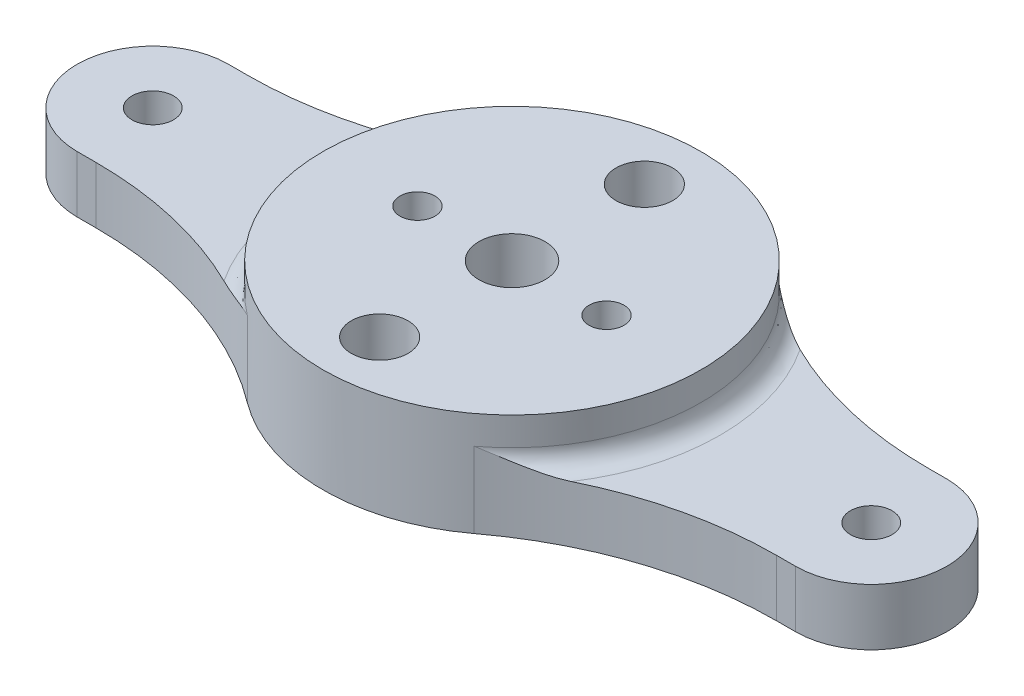
ISO-10303-21;
HEADER;
FILE_DESCRIPTION(('STEP AP214'),'2;1');
FILE_NAME('part.step','',(''),(''),'','','');
FILE_SCHEMA(('AUTOMOTIVE_DESIGN { 1 0 10303 214 1 1 1 1 }'));
ENDSEC;
DATA;
#1=APPLICATION_CONTEXT('core data for automotive mechanical design processes');
#2=APPLICATION_PROTOCOL_DEFINITION('international standard','automotive_design',2000,#1);
#3=PRODUCT_CONTEXT('',#1,'mechanical');
#4=PRODUCT('Part','Part','',(#3));
#5=PRODUCT_RELATED_PRODUCT_CATEGORY('part','',(#4));
#6=PRODUCT_DEFINITION_FORMATION('','',#4);
#7=PRODUCT_DEFINITION_CONTEXT('part definition',#1,'design');
#8=PRODUCT_DEFINITION('design','',#6,#7);
#9=PRODUCT_DEFINITION_SHAPE('','',#8);
#10=(LENGTH_UNIT() NAMED_UNIT(*) SI_UNIT(.MILLI.,.METRE.));
#11=(NAMED_UNIT(*) PLANE_ANGLE_UNIT() SI_UNIT($,.RADIAN.));
#12=(NAMED_UNIT(*) SI_UNIT($,.STERADIAN.) SOLID_ANGLE_UNIT());
#13=UNCERTAINTY_MEASURE_WITH_UNIT(LENGTH_MEASURE(1.E-05),#10,'distance_accuracy_value','');
#14=(GEOMETRIC_REPRESENTATION_CONTEXT(3) GLOBAL_UNCERTAINTY_ASSIGNED_CONTEXT((#13)) GLOBAL_UNIT_ASSIGNED_CONTEXT((#10,
#11,#12)) REPRESENTATION_CONTEXT('',''));
#15=CARTESIAN_POINT('',(0.,0.,0.));
#16=DIRECTION('',(0.,0.,1.));
#17=DIRECTION('',(1.,0.,0.));
#18=AXIS2_PLACEMENT_3D('',#15,#16,#17);
#19=CARTESIAN_POINT('',(0.,-2.49999999998515E-05,-7.));
#20=DIRECTION('',(0.,1.,0.));
#21=DIRECTION('',(0.,0.,1.));
#22=AXIS2_PLACEMENT_3D('',#19,#20,#21);
#23=CYLINDRICAL_SURFACE('',#22,1.5);
#24=CARTESIAN_POINT('',(0.,5.5,-7.));
#25=DIRECTION('',(0.,1.,0.));
#26=DIRECTION('',(0.,0.,1.));
#27=AXIS2_PLACEMENT_3D('',#24,#25,#26);
#28=CIRCLE('',#27,1.5);
#29=CARTESIAN_POINT('',(0.,5.5,-5.5));
#30=VERTEX_POINT('',#29);
#31=EDGE_CURVE('E520',#30,#30,#28,.T.);
#32=ORIENTED_EDGE('',*,*,#31,.T.);
#33=EDGE_LOOP('',(#32));
#34=FACE_BOUND('',#33,.T.);
#35=CARTESIAN_POINT('',(0.,2.3,-7.));
#36=DIRECTION('',(0.,-1.,0.));
#37=DIRECTION('',(0.,0.,-1.));
#38=AXIS2_PLACEMENT_3D('',#35,#36,#37);
#39=CIRCLE('',#38,1.5);
#40=CARTESIAN_POINT('',(0.,2.3,-8.5));
#41=VERTEX_POINT('',#40);
#42=EDGE_CURVE('E11',#41,#41,#39,.F.);
#43=ORIENTED_EDGE('',*,*,#42,.F.);
#44=EDGE_LOOP('',(#43));
#45=FACE_BOUND('',#44,.T.);
#46=ADVANCED_FACE('F35',(#34,#45),#23,.F.);
#47=CARTESIAN_POINT('',(0.,-2.49999999998515E-05,7.));
#48=DIRECTION('',(0.,1.,0.));
#49=DIRECTION('',(0.,0.,1.));
#50=AXIS2_PLACEMENT_3D('',#47,#48,#49);
#51=CYLINDRICAL_SURFACE('',#50,1.5);
#52=CARTESIAN_POINT('',(0.,5.5,7.));
#53=DIRECTION('',(0.,1.,0.));
#54=DIRECTION('',(0.,0.,1.));
#55=AXIS2_PLACEMENT_3D('',#52,#53,#54);
#56=CIRCLE('',#55,1.5);
#57=CARTESIAN_POINT('',(0.,5.5,8.5));
#58=VERTEX_POINT('',#57);
#59=EDGE_CURVE('E518',#58,#58,#56,.T.);
#60=ORIENTED_EDGE('',*,*,#59,.T.);
#61=EDGE_LOOP('',(#60));
#62=FACE_BOUND('',#61,.T.);
#63=CARTESIAN_POINT('',(0.,2.3,7.));
#64=DIRECTION('',(0.,-1.,0.));
#65=DIRECTION('',(0.,0.,-1.));
#66=AXIS2_PLACEMENT_3D('',#63,#64,#65);
#67=CIRCLE('',#66,1.5);
#68=CARTESIAN_POINT('',(0.,2.3,5.5));
#69=VERTEX_POINT('',#68);
#70=EDGE_CURVE('E44',#69,#69,#67,.F.);
#71=ORIENTED_EDGE('',*,*,#70,.F.);
#72=EDGE_LOOP('',(#71));
#73=FACE_BOUND('',#72,.T.);
#74=ADVANCED_FACE('F279',(#62,#73),#51,.F.);
#75=CARTESIAN_POINT('',(0.,3.,0.));
#76=DIRECTION('',(0.,1.,0.));
#77=DIRECTION('',(0.,0.,1.));
#78=AXIS2_PLACEMENT_3D('',#75,#76,#77);
#79=PLANE('',#78);
#80=CARTESIAN_POINT('',(18.,3.,-24.));
#81=DIRECTION('',(0.,1.,0.));
#82=DIRECTION('',(0.,0.,1.));
#83=AXIS2_PLACEMENT_3D('',#80,#81,#82);
#84=CIRCLE('',#83,20.);
#85=CARTESIAN_POINT('',(18.,3.,-4.));
#86=VERTEX_POINT('',#85);
#87=CARTESIAN_POINT('',(9.19020133548054,3.,-6.0448489983896));
#88=VERTEX_POINT('',#87);
#89=EDGE_CURVE('E214',#86,#88,#84,.F.);
#90=ORIENTED_EDGE('',*,*,#89,.T.);
#91=CARTESIAN_POINT('',(0.,3.,0.));
#92=DIRECTION('',(0.,1.,0.));
#93=DIRECTION('',(0.,0.,1.));
#94=AXIS2_PLACEMENT_3D('',#91,#92,#93);
#95=CIRCLE('',#94,11.);
#96=CARTESIAN_POINT('',(9.19020133548054,3.,6.0448489983896));
#97=VERTEX_POINT('',#96);
#98=EDGE_CURVE('E233',#88,#97,#95,.F.);
#99=ORIENTED_EDGE('',*,*,#98,.T.);
#100=CARTESIAN_POINT('',(18.,3.,24.));
#101=DIRECTION('',(0.,1.,0.));
#102=DIRECTION('',(0.,0.,1.));
#103=AXIS2_PLACEMENT_3D('',#100,#101,#102);
#104=CIRCLE('',#103,20.);
#105=CARTESIAN_POINT('',(18.,3.,4.));
#106=VERTEX_POINT('',#105);
#107=EDGE_CURVE('E147',#97,#106,#104,.F.);
#108=ORIENTED_EDGE('',*,*,#107,.T.);
#109=DIRECTION('',(1.,0.,0.));
#110=VECTOR('',#109,1.);
#111=CARTESIAN_POINT('',(9.16515138991168,3.,4.));
#112=LINE('',#111,#110);
#113=CARTESIAN_POINT('',(19.,3.,4.));
#114=VERTEX_POINT('',#113);
#115=EDGE_CURVE('E137',#106,#114,#112,.T.);
#116=ORIENTED_EDGE('',*,*,#115,.T.);
#117=CARTESIAN_POINT('',(19.,3.,0.));
#118=DIRECTION('',(0.,1.,0.));
#119=DIRECTION('',(0.,0.,1.));
#120=AXIS2_PLACEMENT_3D('',#117,#118,#119);
#121=CIRCLE('',#120,4.);
#122=CARTESIAN_POINT('',(19.,3.,-4.));
#123=VERTEX_POINT('',#122);
#124=EDGE_CURVE('E144',#114,#123,#121,.T.);
#125=ORIENTED_EDGE('',*,*,#124,.T.);
#126=DIRECTION('',(-1.,0.,0.));
#127=VECTOR('',#126,1.);
#128=CARTESIAN_POINT('',(9.16515138991168,3.,-4.));
#129=LINE('',#128,#127);
#130=EDGE_CURVE('E166',#123,#86,#129,.T.);
#131=ORIENTED_EDGE('',*,*,#130,.T.);
#132=EDGE_LOOP('',(#90,#99,#108,#116,#125,#131));
#133=FACE_BOUND('',#132,.T.);
#134=CARTESIAN_POINT('',(19.,3.,0.));
#135=DIRECTION('',(0.,1.,0.));
#136=DIRECTION('',(0.,0.,1.));
#137=AXIS2_PLACEMENT_3D('',#134,#135,#136);
#138=CIRCLE('',#137,1.1);
#139=CARTESIAN_POINT('',(19.,3.,1.1));
#140=VERTEX_POINT('',#139);
#141=EDGE_CURVE('E533',#140,#140,#138,.T.);
#142=ORIENTED_EDGE('',*,*,#141,.F.);
#143=EDGE_LOOP('',(#142));
#144=FACE_BOUND('',#143,.T.);
#145=ADVANCED_FACE('F140',(#133,#144),#79,.T.);
#146=CARTESIAN_POINT('',(-18.,3.,24.));
#147=DIRECTION('',(0.,1.,0.));
#148=DIRECTION('',(0.,0.,1.));
#149=AXIS2_PLACEMENT_3D('',#146,#147,#148);
#150=CIRCLE('',#149,20.);
#151=CARTESIAN_POINT('',(-18.,3.,4.));
#152=VERTEX_POINT('',#151);
#153=CARTESIAN_POINT('',(-9.19020133548054,3.,6.04484899838959));
#154=VERTEX_POINT('',#153);
#155=EDGE_CURVE('E222',#152,#154,#150,.F.);
#156=ORIENTED_EDGE('',*,*,#155,.T.);
#157=CARTESIAN_POINT('',(0.,3.,0.));
#158=DIRECTION('',(0.,1.,0.));
#159=DIRECTION('',(0.,0.,1.));
#160=AXIS2_PLACEMENT_3D('',#157,#158,#159);
#161=CIRCLE('',#160,11.);
#162=CARTESIAN_POINT('',(-9.19020133548054,3.,-6.04484899838959));
#163=VERTEX_POINT('',#162);
#164=EDGE_CURVE('E58',#154,#163,#161,.F.);
#165=ORIENTED_EDGE('',*,*,#164,.T.);
#166=CARTESIAN_POINT('',(-18.,3.,-24.));
#167=DIRECTION('',(0.,1.,0.));
#168=DIRECTION('',(0.,0.,1.));
#169=AXIS2_PLACEMENT_3D('',#166,#167,#168);
#170=CIRCLE('',#169,20.);
#171=CARTESIAN_POINT('',(-18.,3.,-4.));
#172=VERTEX_POINT('',#171);
#173=EDGE_CURVE('E218',#163,#172,#170,.F.);
#174=ORIENTED_EDGE('',*,*,#173,.T.);
#175=DIRECTION('',(-1.,0.,0.));
#176=VECTOR('',#175,1.);
#177=CARTESIAN_POINT('',(-19.,3.,-4.));
#178=LINE('',#177,#176);
#179=CARTESIAN_POINT('',(-19.,3.,-4.));
#180=VERTEX_POINT('',#179);
#181=EDGE_CURVE('E168',#172,#180,#178,.T.);
#182=ORIENTED_EDGE('',*,*,#181,.T.);
#183=CARTESIAN_POINT('',(-19.,3.,0.));
#184=DIRECTION('',(0.,1.,0.));
#185=DIRECTION('',(0.,0.,1.));
#186=AXIS2_PLACEMENT_3D('',#183,#184,#185);
#187=CIRCLE('',#186,4.);
#188=CARTESIAN_POINT('',(-19.,3.,4.));
#189=VERTEX_POINT('',#188);
#190=EDGE_CURVE('E174',#180,#189,#187,.T.);
#191=ORIENTED_EDGE('',*,*,#190,.T.);
#192=DIRECTION('',(1.,0.,0.));
#193=VECTOR('',#192,1.);
#194=CARTESIAN_POINT('',(-19.,3.,4.));
#195=LINE('',#194,#193);
#196=EDGE_CURVE('E176',#189,#152,#195,.T.);
#197=ORIENTED_EDGE('',*,*,#196,.T.);
#198=EDGE_LOOP('',(#156,#165,#174,#182,#191,#197));
#199=FACE_BOUND('',#198,.T.);
#200=CARTESIAN_POINT('',(-19.,3.,0.));
#201=DIRECTION('',(0.,1.,0.));
#202=DIRECTION('',(0.,0.,1.));
#203=AXIS2_PLACEMENT_3D('',#200,#201,#202);
#204=CIRCLE('',#203,1.1);
#205=CARTESIAN_POINT('',(-19.,3.,1.1));
#206=VERTEX_POINT('',#205);
#207=EDGE_CURVE('E180',#206,#206,#204,.T.);
#208=ORIENTED_EDGE('',*,*,#207,.F.);
#209=EDGE_LOOP('',(#208));
#210=FACE_BOUND('',#209,.T.);
#211=ADVANCED_FACE('F287',(#199,#210),#79,.T.);
#212=CARTESIAN_POINT('',(0.,0.,0.));
#213=DIRECTION('',(0.,1.,0.));
#214=DIRECTION('',(0.,0.,1.));
#215=AXIS2_PLACEMENT_3D('',#212,#213,#214);
#216=PLANE('',#215);
#217=CARTESIAN_POINT('',(0.,0.,-7.));
#218=DIRECTION('',(0.,-1.,0.));
#219=DIRECTION('',(0.,0.,-1.));
#220=AXIS2_PLACEMENT_3D('',#217,#218,#219);
#221=CIRCLE('',#220,2.6);
#222=CARTESIAN_POINT('',(0.,0.,-9.6));
#223=VERTEX_POINT('',#222);
#224=EDGE_CURVE('E616',#223,#223,#221,.T.);
#225=ORIENTED_EDGE('',*,*,#224,.F.);
#226=EDGE_LOOP('',(#225));
#227=FACE_BOUND('',#226,.T.);
#228=CARTESIAN_POINT('',(0.,0.,7.));
#229=DIRECTION('',(0.,-1.,0.));
#230=DIRECTION('',(0.,0.,-1.));
#231=AXIS2_PLACEMENT_3D('',#228,#229,#230);
#232=CIRCLE('',#231,2.6);
#233=CARTESIAN_POINT('',(0.,0.,4.4));
#234=VERTEX_POINT('',#233);
#235=EDGE_CURVE('E610',#234,#234,#232,.T.);
#236=ORIENTED_EDGE('',*,*,#235,.F.);
#237=EDGE_LOOP('',(#236));
#238=FACE_BOUND('',#237,.T.);
#239=CARTESIAN_POINT('',(5.,0.,0.));
#240=DIRECTION('',(0.,1.,0.));
#241=DIRECTION('',(0.,0.,1.));
#242=AXIS2_PLACEMENT_3D('',#239,#240,#241);
#243=CIRCLE('',#242,0.925);
#244=CARTESIAN_POINT('',(5.,0.,0.925));
#245=VERTEX_POINT('',#244);
#246=EDGE_CURVE('E505',#245,#245,#243,.T.);
#247=ORIENTED_EDGE('',*,*,#246,.T.);
#248=EDGE_LOOP('',(#247));
#249=FACE_BOUND('',#248,.T.);
#250=CARTESIAN_POINT('',(-5.,0.,0.));
#251=DIRECTION('',(0.,1.,0.));
#252=DIRECTION('',(0.,0.,1.));
#253=AXIS2_PLACEMENT_3D('',#250,#251,#252);
#254=CIRCLE('',#253,0.925);
#255=CARTESIAN_POINT('',(-5.,0.,0.925));
#256=VERTEX_POINT('',#255);
#257=EDGE_CURVE('E510',#256,#256,#254,.T.);
#258=ORIENTED_EDGE('',*,*,#257,.T.);
#259=EDGE_LOOP('',(#258));
#260=FACE_BOUND('',#259,.T.);
#261=CARTESIAN_POINT('',(0.,0.,0.));
#262=DIRECTION('',(0.,1.,0.));
#263=DIRECTION('',(0.,0.,1.));
#264=AXIS2_PLACEMENT_3D('',#261,#262,#263);
#265=CIRCLE('',#264,1.75);
#266=CARTESIAN_POINT('',(0.,0.,1.75));
#267=VERTEX_POINT('',#266);
#268=EDGE_CURVE('E526',#267,#267,#265,.T.);
#269=ORIENTED_EDGE('',*,*,#268,.T.);
#270=EDGE_LOOP('',(#269));
#271=FACE_BOUND('',#270,.T.);
#272=CARTESIAN_POINT('',(0.,0.,0.));
#273=DIRECTION('',(0.,1.,0.));
#274=DIRECTION('',(0.,0.,1.));
#275=AXIS2_PLACEMENT_3D('',#272,#273,#274);
#276=CIRCLE('',#275,10.);
#277=CARTESIAN_POINT('',(-6.,0.,8.));
#278=VERTEX_POINT('',#277);
#279=CARTESIAN_POINT('',(6.,0.,8.));
#280=VERTEX_POINT('',#279);
#281=EDGE_CURVE('E177',#278,#280,#276,.T.);
#282=ORIENTED_EDGE('',*,*,#281,.F.);
#283=CARTESIAN_POINT('',(-18.,0.,24.));
#284=DIRECTION('',(0.,1.,0.));
#285=DIRECTION('',(0.,0.,1.));
#286=AXIS2_PLACEMENT_3D('',#283,#284,#285);
#287=CIRCLE('',#286,20.);
#288=CARTESIAN_POINT('',(-18.,0.,4.));
#289=VERTEX_POINT('',#288);
#290=EDGE_CURVE('E220',#278,#289,#287,.T.);
#291=ORIENTED_EDGE('',*,*,#290,.T.);
#292=DIRECTION('',(1.,0.,0.));
#293=VECTOR('',#292,1.);
#294=CARTESIAN_POINT('',(-19.,0.,4.));
#295=LINE('',#294,#293);
#296=CARTESIAN_POINT('',(-19.,0.,4.));
#297=VERTEX_POINT('',#296);
#298=EDGE_CURVE('E151',#297,#289,#295,.T.);
#299=ORIENTED_EDGE('',*,*,#298,.F.);
#300=CARTESIAN_POINT('',(-19.,0.,0.));
#301=DIRECTION('',(0.,1.,0.));
#302=DIRECTION('',(0.,0.,1.));
#303=AXIS2_PLACEMENT_3D('',#300,#301,#302);
#304=CIRCLE('',#303,4.);
#305=CARTESIAN_POINT('',(-19.,0.,-4.));
#306=VERTEX_POINT('',#305);
#307=EDGE_CURVE('E192',#306,#297,#304,.T.);
#308=ORIENTED_EDGE('',*,*,#307,.F.);
#309=DIRECTION('',(-1.,0.,0.));
#310=VECTOR('',#309,1.);
#311=CARTESIAN_POINT('',(-19.,0.,-4.));
#312=LINE('',#311,#310);
#313=CARTESIAN_POINT('',(-18.,0.,-4.));
#314=VERTEX_POINT('',#313);
#315=EDGE_CURVE('E190',#314,#306,#312,.T.);
#316=ORIENTED_EDGE('',*,*,#315,.F.);
#317=CARTESIAN_POINT('',(-18.,0.,-24.));
#318=DIRECTION('',(0.,1.,0.));
#319=DIRECTION('',(0.,0.,1.));
#320=AXIS2_PLACEMENT_3D('',#317,#318,#319);
#321=CIRCLE('',#320,20.);
#322=CARTESIAN_POINT('',(-6.,0.,-8.));
#323=VERTEX_POINT('',#322);
#324=EDGE_CURVE('E216',#314,#323,#321,.T.);
#325=ORIENTED_EDGE('',*,*,#324,.T.);
#326=CARTESIAN_POINT('',(0.,0.,0.));
#327=DIRECTION('',(0.,1.,0.));
#328=DIRECTION('',(0.,0.,1.));
#329=AXIS2_PLACEMENT_3D('',#326,#327,#328);
#330=CIRCLE('',#329,10.);
#331=CARTESIAN_POINT('',(6.,0.,-8.));
#332=VERTEX_POINT('',#331);
#333=EDGE_CURVE('E187',#332,#323,#330,.T.);
#334=ORIENTED_EDGE('',*,*,#333,.F.);
#335=CARTESIAN_POINT('',(18.,0.,-24.));
#336=DIRECTION('',(0.,1.,0.));
#337=DIRECTION('',(0.,0.,1.));
#338=AXIS2_PLACEMENT_3D('',#335,#336,#337);
#339=CIRCLE('',#338,20.);
#340=CARTESIAN_POINT('',(18.,0.,-4.));
#341=VERTEX_POINT('',#340);
#342=EDGE_CURVE('E212',#332,#341,#339,.T.);
#343=ORIENTED_EDGE('',*,*,#342,.T.);
#344=DIRECTION('',(-1.,0.,0.));
#345=VECTOR('',#344,1.);
#346=CARTESIAN_POINT('',(9.16515138991168,0.,-4.));
#347=LINE('',#346,#345);
#348=CARTESIAN_POINT('',(19.,0.,-4.));
#349=VERTEX_POINT('',#348);
#350=EDGE_CURVE('E184',#349,#341,#347,.T.);
#351=ORIENTED_EDGE('',*,*,#350,.F.);
#352=CARTESIAN_POINT('',(19.,0.,0.));
#353=DIRECTION('',(0.,1.,0.));
#354=DIRECTION('',(0.,0.,1.));
#355=AXIS2_PLACEMENT_3D('',#352,#353,#354);
#356=CIRCLE('',#355,4.);
#357=CARTESIAN_POINT('',(19.,0.,4.));
#358=VERTEX_POINT('',#357);
#359=EDGE_CURVE('E182',#358,#349,#356,.T.);
#360=ORIENTED_EDGE('',*,*,#359,.F.);
#361=DIRECTION('',(1.,0.,0.));
#362=VECTOR('',#361,1.);
#363=CARTESIAN_POINT('',(9.16515138991168,0.,4.));
#364=LINE('',#363,#362);
#365=CARTESIAN_POINT('',(18.,0.,4.));
#366=VERTEX_POINT('',#365);
#367=EDGE_CURVE('E157',#366,#358,#364,.T.);
#368=ORIENTED_EDGE('',*,*,#367,.F.);
#369=CARTESIAN_POINT('',(18.,0.,24.));
#370=DIRECTION('',(0.,1.,0.));
#371=DIRECTION('',(0.,0.,1.));
#372=AXIS2_PLACEMENT_3D('',#369,#370,#371);
#373=CIRCLE('',#372,20.);
#374=EDGE_CURVE('E224',#366,#280,#373,.T.);
#375=ORIENTED_EDGE('',*,*,#374,.T.);
#376=EDGE_LOOP('',(#282,#291,#299,#308,#316,#325,#334,#343,#351,#360,#368,#375));
#377=FACE_BOUND('',#376,.T.);
#378=CARTESIAN_POINT('',(-19.,0.,0.));
#379=DIRECTION('',(0.,1.,0.));
#380=DIRECTION('',(0.,0.,1.));
#381=AXIS2_PLACEMENT_3D('',#378,#379,#380);
#382=CIRCLE('',#381,1.1);
#383=CARTESIAN_POINT('',(-19.,0.,1.1));
#384=VERTEX_POINT('',#383);
#385=EDGE_CURVE('E172',#384,#384,#382,.T.);
#386=ORIENTED_EDGE('',*,*,#385,.T.);
#387=EDGE_LOOP('',(#386));
#388=FACE_BOUND('',#387,.T.);
#389=CARTESIAN_POINT('',(19.,0.,0.));
#390=DIRECTION('',(0.,1.,0.));
#391=DIRECTION('',(0.,0.,1.));
#392=AXIS2_PLACEMENT_3D('',#389,#390,#391);
#393=CIRCLE('',#392,1.1);
#394=CARTESIAN_POINT('',(19.,0.,1.1));
#395=VERTEX_POINT('',#394);
#396=EDGE_CURVE('E532',#395,#395,#393,.T.);
#397=ORIENTED_EDGE('',*,*,#396,.T.);
#398=EDGE_LOOP('',(#397));
#399=FACE_BOUND('',#398,.T.);
#400=ADVANCED_FACE('F314',(#227,#238,#249,#260,#271,#377,#388,#399),#216,.F.);
#401=CARTESIAN_POINT('',(9.16515138991168,3.,4.));
#402=DIRECTION('',(0.,0.,-1.));
#403=DIRECTION('',(-1.,0.,0.));
#404=AXIS2_PLACEMENT_3D('',#401,#402,#403);
#405=PLANE('',#404);
#406=ORIENTED_EDGE('',*,*,#115,.F.);
#407=DIRECTION('',(0.,1.,0.));
#408=VECTOR('',#407,1.);
#409=CARTESIAN_POINT('',(18.,0.,4.));
#410=LINE('',#409,#408);
#411=EDGE_CURVE('E210',#106,#366,#410,.F.);
#412=ORIENTED_EDGE('',*,*,#411,.T.);
#413=ORIENTED_EDGE('',*,*,#367,.T.);
#414=DIRECTION('',(0.,-1.,0.));
#415=VECTOR('',#414,1.);
#416=CARTESIAN_POINT('',(19.,3.,4.));
#417=LINE('',#416,#415);
#418=EDGE_CURVE('E154',#114,#358,#417,.T.);
#419=ORIENTED_EDGE('',*,*,#418,.F.);
#420=EDGE_LOOP('',(#406,#412,#413,#419));
#421=FACE_BOUND('',#420,.T.);
#422=ADVANCED_FACE('F155',(#421),#405,.F.);
#423=CARTESIAN_POINT('',(19.,3.,0.));
#424=DIRECTION('',(0.,-1.,0.));
#425=DIRECTION('',(0.,0.,-1.));
#426=AXIS2_PLACEMENT_3D('',#423,#424,#425);
#427=CYLINDRICAL_SURFACE('',#426,4.);
#428=ORIENTED_EDGE('',*,*,#359,.T.);
#429=DIRECTION('',(0.,-1.,0.));
#430=VECTOR('',#429,1.);
#431=CARTESIAN_POINT('',(19.,3.,-4.));
#432=LINE('',#431,#430);
#433=EDGE_CURVE('E161',#123,#349,#432,.T.);
#434=ORIENTED_EDGE('',*,*,#433,.F.);
#435=ORIENTED_EDGE('',*,*,#124,.F.);
#436=ORIENTED_EDGE('',*,*,#418,.T.);
#437=EDGE_LOOP('',(#428,#434,#435,#436));
#438=FACE_BOUND('',#437,.T.);
#439=ADVANCED_FACE('F163',(#438),#427,.T.);
#440=CARTESIAN_POINT('',(9.16515138991168,3.,-4.));
#441=DIRECTION('',(0.,0.,1.));
#442=DIRECTION('',(1.,0.,0.));
#443=AXIS2_PLACEMENT_3D('',#440,#441,#442);
#444=PLANE('',#443);
#445=ORIENTED_EDGE('',*,*,#350,.T.);
#446=DIRECTION('',(0.,1.,0.));
#447=VECTOR('',#446,1.);
#448=CARTESIAN_POINT('',(18.,3.,-4.));
#449=LINE('',#448,#447);
#450=EDGE_CURVE('E573',#341,#86,#449,.T.);
#451=ORIENTED_EDGE('',*,*,#450,.T.);
#452=ORIENTED_EDGE('',*,*,#130,.F.);
#453=ORIENTED_EDGE('',*,*,#433,.T.);
#454=EDGE_LOOP('',(#445,#451,#452,#453));
#455=FACE_BOUND('',#454,.T.);
#456=ADVANCED_FACE('F332',(#455),#444,.F.);
#457=CARTESIAN_POINT('',(0.,3.,0.));
#458=DIRECTION('',(0.,-1.,0.));
#459=DIRECTION('',(0.,0.,-1.));
#460=AXIS2_PLACEMENT_3D('',#457,#458,#459);
#461=CYLINDRICAL_SURFACE('',#460,10.);
#462=CARTESIAN_POINT('',(0.,4.,0.));
#463=DIRECTION('',(0.,1.,0.));
#464=DIRECTION('',(0.,0.,1.));
#465=AXIS2_PLACEMENT_3D('',#462,#463,#464);
#466=CIRCLE('',#465,10.);
#467=CARTESIAN_POINT('',(6.,4.,8.));
#468=VERTEX_POINT('',#467);
#469=CARTESIAN_POINT('',(6.,4.,-8.));
#470=VERTEX_POINT('',#469);
#471=EDGE_CURVE('E230',#468,#470,#466,.T.);
#472=ORIENTED_EDGE('',*,*,#471,.T.);
#473=DIRECTION('',(0.,-1.,0.));
#474=VECTOR('',#473,1.);
#475=CARTESIAN_POINT('',(6.,3.,-8.));
#476=LINE('',#475,#474);
#477=EDGE_CURVE('E570',#470,#332,#476,.T.);
#478=ORIENTED_EDGE('',*,*,#477,.T.);
#479=ORIENTED_EDGE('',*,*,#333,.T.);
#480=DIRECTION('',(0.,-1.,0.));
#481=VECTOR('',#480,1.);
#482=CARTESIAN_POINT('',(-6.,3.,-8.));
#483=LINE('',#482,#481);
#484=CARTESIAN_POINT('',(-6.,4.,-8.));
#485=VERTEX_POINT('',#484);
#486=EDGE_CURVE('E564',#323,#485,#483,.F.);
#487=ORIENTED_EDGE('',*,*,#486,.T.);
#488=CARTESIAN_POINT('',(0.,4.,0.));
#489=DIRECTION('',(0.,1.,0.));
#490=DIRECTION('',(0.,0.,1.));
#491=AXIS2_PLACEMENT_3D('',#488,#489,#490);
#492=CIRCLE('',#491,10.);
#493=CARTESIAN_POINT('',(-6.,4.,8.));
#494=VERTEX_POINT('',#493);
#495=EDGE_CURVE('E227',#485,#494,#492,.T.);
#496=ORIENTED_EDGE('',*,*,#495,.T.);
#497=DIRECTION('',(0.,-1.,0.));
#498=VECTOR('',#497,1.);
#499=CARTESIAN_POINT('',(-6.,3.,8.));
#500=LINE('',#499,#498);
#501=EDGE_CURVE('E560',#494,#278,#500,.T.);
#502=ORIENTED_EDGE('',*,*,#501,.T.);
#503=ORIENTED_EDGE('',*,*,#281,.T.);
#504=DIRECTION('',(0.,-1.,0.));
#505=VECTOR('',#504,1.);
#506=CARTESIAN_POINT('',(6.,3.,8.));
#507=LINE('',#506,#505);
#508=EDGE_CURVE('E160',#280,#468,#507,.F.);
#509=ORIENTED_EDGE('',*,*,#508,.T.);
#510=EDGE_LOOP('',(#472,#478,#479,#487,#496,#502,#503,#509));
#511=FACE_BOUND('',#510,.T.);
#512=CARTESIAN_POINT('',(0.,5.5,0.));
#513=DIRECTION('',(0.,1.,0.));
#514=DIRECTION('',(0.,0.,1.));
#515=AXIS2_PLACEMENT_3D('',#512,#513,#514);
#516=CIRCLE('',#515,10.);
#517=CARTESIAN_POINT('',(0.,5.5,10.));
#518=VERTEX_POINT('',#517);
#519=EDGE_CURVE('E529',#518,#518,#516,.T.);
#520=ORIENTED_EDGE('',*,*,#519,.F.);
#521=EDGE_LOOP('',(#520));
#522=FACE_BOUND('',#521,.T.);
#523=ADVANCED_FACE('F328',(#511,#522),#461,.T.);
#524=CARTESIAN_POINT('',(-19.,3.,-4.));
#525=DIRECTION('',(0.,0.,1.));
#526=DIRECTION('',(1.,0.,0.));
#527=AXIS2_PLACEMENT_3D('',#524,#525,#526);
#528=PLANE('',#527);
#529=ORIENTED_EDGE('',*,*,#181,.F.);
#530=DIRECTION('',(0.,1.,0.));
#531=VECTOR('',#530,1.);
#532=CARTESIAN_POINT('',(-18.,0.,-4.));
#533=LINE('',#532,#531);
#534=EDGE_CURVE('E575',#172,#314,#533,.F.);
#535=ORIENTED_EDGE('',*,*,#534,.T.);
#536=ORIENTED_EDGE('',*,*,#315,.T.);
#537=DIRECTION('',(0.,-1.,0.));
#538=VECTOR('',#537,1.);
#539=CARTESIAN_POINT('',(-19.,3.,-4.));
#540=LINE('',#539,#538);
#541=EDGE_CURVE('E199',#180,#306,#540,.T.);
#542=ORIENTED_EDGE('',*,*,#541,.F.);
#543=EDGE_LOOP('',(#529,#535,#536,#542));
#544=FACE_BOUND('',#543,.T.);
#545=ADVANCED_FACE('F324',(#544),#528,.F.);
#546=CARTESIAN_POINT('',(-19.,3.,0.));
#547=DIRECTION('',(0.,-1.,0.));
#548=DIRECTION('',(0.,0.,-1.));
#549=AXIS2_PLACEMENT_3D('',#546,#547,#548);
#550=CYLINDRICAL_SURFACE('',#549,4.);
#551=ORIENTED_EDGE('',*,*,#307,.T.);
#552=DIRECTION('',(0.,-1.,0.));
#553=VECTOR('',#552,1.);
#554=CARTESIAN_POINT('',(-19.,3.,4.));
#555=LINE('',#554,#553);
#556=EDGE_CURVE('E196',#189,#297,#555,.T.);
#557=ORIENTED_EDGE('',*,*,#556,.F.);
#558=ORIENTED_EDGE('',*,*,#190,.F.);
#559=ORIENTED_EDGE('',*,*,#541,.T.);
#560=EDGE_LOOP('',(#551,#557,#558,#559));
#561=FACE_BOUND('',#560,.T.);
#562=ADVANCED_FACE('F320',(#561),#550,.T.);
#563=CARTESIAN_POINT('',(-19.,3.,4.));
#564=DIRECTION('',(0.,0.,-1.));
#565=DIRECTION('',(-1.,0.,0.));
#566=AXIS2_PLACEMENT_3D('',#563,#564,#565);
#567=PLANE('',#566);
#568=ORIENTED_EDGE('',*,*,#298,.T.);
#569=DIRECTION('',(0.,1.,0.));
#570=VECTOR('',#569,1.);
#571=CARTESIAN_POINT('',(-18.,3.,4.));
#572=LINE('',#571,#570);
#573=EDGE_CURVE('E208',#289,#152,#572,.T.);
#574=ORIENTED_EDGE('',*,*,#573,.T.);
#575=ORIENTED_EDGE('',*,*,#196,.F.);
#576=ORIENTED_EDGE('',*,*,#556,.T.);
#577=EDGE_LOOP('',(#568,#574,#575,#576));
#578=FACE_BOUND('',#577,.T.);
#579=ADVANCED_FACE('F310',(#578),#567,.F.);
#580=CARTESIAN_POINT('',(-19.,3.,0.));
#581=DIRECTION('',(0.,-1.,0.));
#582=DIRECTION('',(0.,0.,-1.));
#583=AXIS2_PLACEMENT_3D('',#580,#581,#582);
#584=CYLINDRICAL_SURFACE('',#583,1.1);
#585=ORIENTED_EDGE('',*,*,#207,.T.);
#586=EDGE_LOOP('',(#585));
#587=FACE_BOUND('',#586,.T.);
#588=ORIENTED_EDGE('',*,*,#385,.F.);
#589=EDGE_LOOP('',(#588));
#590=FACE_BOUND('',#589,.T.);
#591=ADVANCED_FACE('F307',(#587,#590),#584,.F.);
#592=CARTESIAN_POINT('',(19.,3.,0.));
#593=DIRECTION('',(0.,-1.,0.));
#594=DIRECTION('',(0.,0.,-1.));
#595=AXIS2_PLACEMENT_3D('',#592,#593,#594);
#596=CYLINDRICAL_SURFACE('',#595,1.1);
#597=ORIENTED_EDGE('',*,*,#141,.T.);
#598=EDGE_LOOP('',(#597));
#599=FACE_BOUND('',#598,.T.);
#600=ORIENTED_EDGE('',*,*,#396,.F.);
#601=EDGE_LOOP('',(#600));
#602=FACE_BOUND('',#601,.T.);
#603=ADVANCED_FACE('F303',(#599,#602),#596,.F.);
#604=CARTESIAN_POINT('',(0.,5.5,0.));
#605=DIRECTION('',(0.,1.,0.));
#606=DIRECTION('',(0.,0.,1.));
#607=AXIS2_PLACEMENT_3D('',#604,#605,#606);
#608=PLANE('',#607);
#609=CARTESIAN_POINT('',(5.,5.5,0.));
#610=DIRECTION('',(0.,1.,0.));
#611=DIRECTION('',(0.,0.,1.));
#612=AXIS2_PLACEMENT_3D('',#609,#610,#611);
#613=CIRCLE('',#612,0.925);
#614=CARTESIAN_POINT('',(5.,5.5,0.925));
#615=VERTEX_POINT('',#614);
#616=EDGE_CURVE('E502',#615,#615,#613,.T.);
#617=ORIENTED_EDGE('',*,*,#616,.F.);
#618=EDGE_LOOP('',(#617));
#619=FACE_BOUND('',#618,.T.);
#620=CARTESIAN_POINT('',(-5.,5.5,0.));
#621=DIRECTION('',(0.,1.,0.));
#622=DIRECTION('',(0.,0.,1.));
#623=AXIS2_PLACEMENT_3D('',#620,#621,#622);
#624=CIRCLE('',#623,0.925);
#625=CARTESIAN_POINT('',(-5.,5.5,0.925));
#626=VERTEX_POINT('',#625);
#627=EDGE_CURVE('E507',#626,#626,#624,.T.);
#628=ORIENTED_EDGE('',*,*,#627,.F.);
#629=EDGE_LOOP('',(#628));
#630=FACE_BOUND('',#629,.T.);
#631=ORIENTED_EDGE('',*,*,#59,.F.);
#632=EDGE_LOOP('',(#631));
#633=FACE_BOUND('',#632,.T.);
#634=ORIENTED_EDGE('',*,*,#31,.F.);
#635=EDGE_LOOP('',(#634));
#636=FACE_BOUND('',#635,.T.);
#637=CARTESIAN_POINT('',(0.,5.5,0.));
#638=DIRECTION('',(0.,1.,0.));
#639=DIRECTION('',(0.,0.,1.));
#640=AXIS2_PLACEMENT_3D('',#637,#638,#639);
#641=CIRCLE('',#640,1.75);
#642=CARTESIAN_POINT('',(0.,5.5,1.75));
#643=VERTEX_POINT('',#642);
#644=EDGE_CURVE('E523',#643,#643,#641,.T.);
#645=ORIENTED_EDGE('',*,*,#644,.F.);
#646=EDGE_LOOP('',(#645));
#647=FACE_BOUND('',#646,.T.);
#648=ORIENTED_EDGE('',*,*,#519,.T.);
#649=EDGE_LOOP('',(#648));
#650=FACE_BOUND('',#649,.T.);
#651=ADVANCED_FACE('F299',(#619,#630,#633,#636,#647,#650),#608,.T.);
#652=CARTESIAN_POINT('',(0.,-2.49999999998515E-05,0.));
#653=DIRECTION('',(0.,1.,0.));
#654=DIRECTION('',(0.,0.,1.));
#655=AXIS2_PLACEMENT_3D('',#652,#653,#654);
#656=CYLINDRICAL_SURFACE('',#655,1.75);
#657=ORIENTED_EDGE('',*,*,#644,.T.);
#658=EDGE_LOOP('',(#657));
#659=FACE_BOUND('',#658,.T.);
#660=ORIENTED_EDGE('',*,*,#268,.F.);
#661=EDGE_LOOP('',(#660));
#662=FACE_BOUND('',#661,.T.);
#663=ADVANCED_FACE('F296',(#659,#662),#656,.F.);
#664=CARTESIAN_POINT('',(-5.,-2.49999999998515E-05,0.));
#665=DIRECTION('',(0.,1.,0.));
#666=DIRECTION('',(0.,0.,1.));
#667=AXIS2_PLACEMENT_3D('',#664,#665,#666);
#668=CYLINDRICAL_SURFACE('',#667,0.925);
#669=ORIENTED_EDGE('',*,*,#627,.T.);
#670=EDGE_LOOP('',(#669));
#671=FACE_BOUND('',#670,.T.);
#672=ORIENTED_EDGE('',*,*,#257,.F.);
#673=EDGE_LOOP('',(#672));
#674=FACE_BOUND('',#673,.T.);
#675=ADVANCED_FACE('F293',(#671,#674),#668,.F.);
#676=CARTESIAN_POINT('',(5.,-2.49999999998515E-05,0.));
#677=DIRECTION('',(0.,1.,0.));
#678=DIRECTION('',(0.,0.,1.));
#679=AXIS2_PLACEMENT_3D('',#676,#677,#678);
#680=CYLINDRICAL_SURFACE('',#679,0.925);
#681=ORIENTED_EDGE('',*,*,#616,.T.);
#682=EDGE_LOOP('',(#681));
#683=FACE_BOUND('',#682,.T.);
#684=ORIENTED_EDGE('',*,*,#246,.F.);
#685=EDGE_LOOP('',(#684));
#686=FACE_BOUND('',#685,.T.);
#687=ADVANCED_FACE('F454',(#683,#686),#680,.F.);
#688=CARTESIAN_POINT('',(0.,2.1,7.));
#689=DIRECTION('',(0.,-1.,0.));
#690=DIRECTION('',(0.,0.,-1.));
#691=AXIS2_PLACEMENT_3D('',#688,#689,#690);
#692=PLANE('',#691);
#693=CARTESIAN_POINT('',(0.,2.1,7.));
#694=DIRECTION('',(0.,-1.,0.));
#695=DIRECTION('',(0.,0.,-1.));
#696=AXIS2_PLACEMENT_3D('',#693,#694,#695);
#697=CIRCLE('',#696,2.6);
#698=CARTESIAN_POINT('',(0.,2.1,4.4));
#699=VERTEX_POINT('',#698);
#700=EDGE_CURVE('E512',#699,#699,#697,.T.);
#701=ORIENTED_EDGE('',*,*,#700,.T.);
#702=EDGE_LOOP('',(#701));
#703=FACE_BOUND('',#702,.T.);
#704=ADVANCED_FACE('F449',(#703),#692,.T.);
#705=CARTESIAN_POINT('',(0.,2.1,7.));
#706=DIRECTION('',(0.,-1.,0.));
#707=DIRECTION('',(0.,0.,-1.));
#708=AXIS2_PLACEMENT_3D('',#705,#706,#707);
#709=CYLINDRICAL_SURFACE('',#708,2.6);
#710=ORIENTED_EDGE('',*,*,#700,.F.);
#711=EDGE_LOOP('',(#710));
#712=FACE_BOUND('',#711,.T.);
#713=ORIENTED_EDGE('',*,*,#235,.T.);
#714=EDGE_LOOP('',(#713));
#715=FACE_BOUND('',#714,.T.);
#716=ADVANCED_FACE('F453',(#712,#715),#709,.F.);
#717=CARTESIAN_POINT('',(0.,2.1,-7.));
#718=DIRECTION('',(0.,-1.,0.));
#719=DIRECTION('',(0.,0.,-1.));
#720=AXIS2_PLACEMENT_3D('',#717,#718,#719);
#721=PLANE('',#720);
#722=CARTESIAN_POINT('',(0.,2.1,-7.));
#723=DIRECTION('',(0.,-1.,0.));
#724=DIRECTION('',(0.,0.,-1.));
#725=AXIS2_PLACEMENT_3D('',#722,#723,#724);
#726=CIRCLE('',#725,2.6);
#727=CARTESIAN_POINT('',(0.,2.1,-9.6));
#728=VERTEX_POINT('',#727);
#729=EDGE_CURVE('E613',#728,#728,#726,.T.);
#730=ORIENTED_EDGE('',*,*,#729,.T.);
#731=EDGE_LOOP('',(#730));
#732=FACE_BOUND('',#731,.T.);
#733=ADVANCED_FACE('F464',(#732),#721,.T.);
#734=CARTESIAN_POINT('',(0.,2.1,-7.));
#735=DIRECTION('',(0.,-1.,0.));
#736=DIRECTION('',(0.,0.,-1.));
#737=AXIS2_PLACEMENT_3D('',#734,#735,#736);
#738=CYLINDRICAL_SURFACE('',#737,2.6);
#739=ORIENTED_EDGE('',*,*,#729,.F.);
#740=EDGE_LOOP('',(#739));
#741=FACE_BOUND('',#740,.T.);
#742=ORIENTED_EDGE('',*,*,#224,.T.);
#743=EDGE_LOOP('',(#742));
#744=FACE_BOUND('',#743,.T.);
#745=ADVANCED_FACE('F256',(#741,#744),#738,.F.);
#746=CARTESIAN_POINT('',(18.,3.,-24.));
#747=DIRECTION('',(0.,-1.,0.));
#748=DIRECTION('',(0.,0.,-1.));
#749=AXIS2_PLACEMENT_3D('',#746,#747,#748);
#750=CYLINDRICAL_SURFACE('',#749,20.);
#751=ORIENTED_EDGE('',*,*,#89,.F.);
#752=ORIENTED_EDGE('',*,*,#450,.F.);
#753=ORIENTED_EDGE('',*,*,#342,.F.);
#754=ORIENTED_EDGE('',*,*,#477,.F.);
#755=CARTESIAN_POINT('',(9.19020133548054,3.,-6.0448489983896));
#756=CARTESIAN_POINT('',(9.12642684579131,3.0000133900098,-6.07613923221575));
#757=CARTESIAN_POINT('',(9.06284169663492,3.001952594447,-6.10776026451368));
#758=CARTESIAN_POINT('',(8.9362019093234,3.00923990191589,-6.17157948242913));
#759=CARTESIAN_POINT('',(8.87314697792431,3.01458597521167,-6.20377731330976));
#760=CARTESIAN_POINT('',(8.74780976890835,3.02822723402026,-6.26861695376668));
#761=CARTESIAN_POINT('',(8.68552588508357,3.0365145567971,-6.30125735861607));
#762=CARTESIAN_POINT('',(8.56161154971691,3.0556866156274,-6.36702678139536));
#763=CARTESIAN_POINT('',(8.49998120897532,3.0665717849871,-6.40015587997087));
#764=CARTESIAN_POINT('',(8.31717463328775,3.10243871111346,-6.49965622330974));
#765=CARTESIAN_POINT('',(8.19701143729971,3.13075991300713,-6.56669535425319));
#766=CARTESIAN_POINT('',(7.9594235686979,3.19435765428867,-6.70244044179102));
#767=CARTESIAN_POINT('',(7.8420011478737,3.22963970224458,-6.77114768045825));
#768=CARTESIAN_POINT('',(7.57534926791569,3.31684011239661,-6.93080340256722));
#769=CARTESIAN_POINT('',(7.42704359062685,3.370585810277,-7.02229069319961));
#770=CARTESIAN_POINT('',(7.1345557390033,3.48429926226976,-7.20797468118396));
#771=CARTESIAN_POINT('',(6.99037493011429,3.54426904700962,-7.3021722554839));
#772=CARTESIAN_POINT('',(6.56278749914985,3.73026006111867,-7.5893796887671));
#773=CARTESIAN_POINT('',(6.28483425255266,3.86218278050878,-7.78670480724419));
#774=CARTESIAN_POINT('',(6.00812260915435,3.9960682399806,-7.99391047237511));
#775=CARTESIAN_POINT('',(6.00406071879748,3.99803413335169,-7.99695447509759));
#776=CARTESIAN_POINT('',(6.,4.,-8.));
#777=B_SPLINE_CURVE_WITH_KNOTS('',3,(#755,#756,#757,#758,#759,#760,#761,#762,#763,#764,#765,
#766,#767,#768,#769,#770,#771,#772,#773,#774,#775,#776),.UNSPECIFIED.,.F.,.F.,(4,2,2,2,2,2,2,2,
2,2,4),(0.,0.213049297743443,0.425971784018119,0.638329307316046,0.850722275443255,
1.27187661585721,1.69336558957682,2.24017836639837,2.78717010673503,3.88297564839496,
3.89930558104255),.UNSPECIFIED.);
#778=EDGE_CURVE('E236',#470,#88,#777,.F.);
#779=ORIENTED_EDGE('',*,*,#778,.T.);
#780=EDGE_LOOP('',(#751,#752,#753,#754,#779));
#781=FACE_BOUND('',#780,.T.);
#782=ADVANCED_FACE('F250',(#781),#750,.F.);
#783=CARTESIAN_POINT('',(-18.,3.,-24.));
#784=DIRECTION('',(0.,-1.,0.));
#785=DIRECTION('',(0.,0.,-1.));
#786=AXIS2_PLACEMENT_3D('',#783,#784,#785);
#787=CYLINDRICAL_SURFACE('',#786,20.);
#788=ORIENTED_EDGE('',*,*,#173,.F.);
#789=CARTESIAN_POINT('',(-9.19020133548054,3.,-6.04484899838959));
#790=CARTESIAN_POINT('',(-9.1264268457911,3.0000133900098,-6.07613923221585));
#791=CARTESIAN_POINT('',(-9.06284169663451,3.00195259444702,-6.10776026451388));
#792=CARTESIAN_POINT('',(-8.93620190932257,3.00923990191595,-6.17157948242954));
#793=CARTESIAN_POINT('',(-8.87314697792329,3.01458597521176,-6.20377731331028));
#794=CARTESIAN_POINT('',(-8.74780976890697,3.02822723402043,-6.26861695376739));
#795=CARTESIAN_POINT('',(-8.68552588508204,3.03651455679732,-6.30125735861687));
#796=CARTESIAN_POINT('',(-8.56161154971508,3.05568661562771,-6.36702678139634));
#797=CARTESIAN_POINT('',(-8.49998120897333,3.06657178498747,-6.40015587997194));
#798=CARTESIAN_POINT('',(-8.31717463328601,3.10243871111386,-6.49965622331071));
#799=CARTESIAN_POINT('',(-8.19701143729837,3.13075991300749,-6.56669535425394));
#800=CARTESIAN_POINT('',(-7.95942356869726,3.19435765428884,-6.70244044179139));
#801=CARTESIAN_POINT('',(-7.84200114787338,3.2296397022446,-6.77114768045844));
#802=CARTESIAN_POINT('',(-7.57534926791579,3.31684011239669,-6.93080340256716));
#803=CARTESIAN_POINT('',(-7.42704359062709,3.3705858102774,-7.02229069319944));
#804=CARTESIAN_POINT('',(-7.1345557390034,3.48429926226925,-7.20797468118391));
#805=CARTESIAN_POINT('',(-6.99037493011412,3.54426904700788,-7.30217225548406));
#806=CARTESIAN_POINT('',(-6.5627874991511,3.73026006112177,-7.58937968876616));
#807=CARTESIAN_POINT('',(-6.2848342525582,3.86218278052638,-7.78670480723994));
#808=CARTESIAN_POINT('',(-6.0081226091545,3.99606823998113,-7.99391047237499));
#809=CARTESIAN_POINT('',(-6.00406071879756,3.99803413335196,-7.99695447509753));
#810=CARTESIAN_POINT('',(-5.99999999999999,4.,-8.));
#811=B_SPLINE_CURVE_WITH_KNOTS('',3,(#789,#790,#791,#792,#793,#794,#795,#796,#797,#798,#799,
#800,#801,#802,#803,#804,#805,#806,#807,#808,#809,#810),.UNSPECIFIED.,.F.,.F.,(4,2,2,2,2,2,2,2,
2,2,4),(0.,0.213049297744143,0.42597178401951,0.638329307317977,0.850722275445732,
1.27187661585836,1.69336558957679,2.2401783663982,2.78717010673452,3.88297564839499,
3.89930558104256),.UNSPECIFIED.);
#812=EDGE_CURVE('E266',#163,#485,#811,.T.);
#813=ORIENTED_EDGE('',*,*,#812,.T.);
#814=ORIENTED_EDGE('',*,*,#486,.F.);
#815=ORIENTED_EDGE('',*,*,#324,.F.);
#816=ORIENTED_EDGE('',*,*,#534,.F.);
#817=EDGE_LOOP('',(#788,#813,#814,#815,#816));
#818=FACE_BOUND('',#817,.T.);
#819=ADVANCED_FACE('F255',(#818),#787,.F.);
#820=CARTESIAN_POINT('',(-18.,3.,24.));
#821=DIRECTION('',(0.,-1.,0.));
#822=DIRECTION('',(0.,0.,-1.));
#823=AXIS2_PLACEMENT_3D('',#820,#821,#822);
#824=CYLINDRICAL_SURFACE('',#823,20.);
#825=ORIENTED_EDGE('',*,*,#155,.F.);
#826=ORIENTED_EDGE('',*,*,#573,.F.);
#827=ORIENTED_EDGE('',*,*,#290,.F.);
#828=ORIENTED_EDGE('',*,*,#501,.F.);
#829=CARTESIAN_POINT('',(-9.19020133548054,3.,6.04484899838959));
#830=CARTESIAN_POINT('',(-9.1264268457911,3.0000133900098,6.07613923221585));
#831=CARTESIAN_POINT('',(-9.06284169663451,3.00195259444702,6.10776026451388));
#832=CARTESIAN_POINT('',(-8.93620190932257,3.00923990191595,6.17157948242954));
#833=CARTESIAN_POINT('',(-8.87314697792329,3.01458597521176,6.20377731331028));
#834=CARTESIAN_POINT('',(-8.74780976890697,3.02822723402043,6.26861695376739));
#835=CARTESIAN_POINT('',(-8.68552588508204,3.03651455679732,6.30125735861687));
#836=CARTESIAN_POINT('',(-8.56161154971508,3.05568661562771,6.36702678139634));
#837=CARTESIAN_POINT('',(-8.49998120897333,3.06657178498747,6.40015587997194));
#838=CARTESIAN_POINT('',(-8.31717463328601,3.10243871111386,6.49965622331071));
#839=CARTESIAN_POINT('',(-8.19701143729837,3.13075991300749,6.56669535425394));
#840=CARTESIAN_POINT('',(-7.95942356869726,3.19435765428884,6.70244044179139));
#841=CARTESIAN_POINT('',(-7.84200114787338,3.2296397022446,6.77114768045844));
#842=CARTESIAN_POINT('',(-7.57534926791579,3.31684011239669,6.93080340256716));
#843=CARTESIAN_POINT('',(-7.42704359062709,3.3705858102774,7.02229069319944));
#844=CARTESIAN_POINT('',(-7.1345557390034,3.48429926226925,7.20797468118391));
#845=CARTESIAN_POINT('',(-6.99037493011412,3.54426904700788,7.30217225548406));
#846=CARTESIAN_POINT('',(-6.5627874991511,3.73026006112177,7.58937968876616));
#847=CARTESIAN_POINT('',(-6.2848342525582,3.86218278052638,7.78670480723994));
#848=CARTESIAN_POINT('',(-6.0081226091545,3.99606823998113,7.99391047237499));
#849=CARTESIAN_POINT('',(-6.00406071879756,3.99803413335196,7.99695447509753));
#850=CARTESIAN_POINT('',(-5.99999999999999,4.,8.));
#851=B_SPLINE_CURVE_WITH_KNOTS('',3,(#829,#830,#831,#832,#833,#834,#835,#836,#837,#838,#839,
#840,#841,#842,#843,#844,#845,#846,#847,#848,#849,#850),.UNSPECIFIED.,.F.,.F.,(4,2,2,2,2,2,2,2,
2,2,4),(0.,0.213049297744143,0.42597178401951,0.638329307317977,0.850722275445732,
1.27187661585836,1.69336558957679,2.2401783663982,2.78717010673452,3.88297564839499,
3.89930558104256),.UNSPECIFIED.);
#852=EDGE_CURVE('E51',#494,#154,#851,.F.);
#853=ORIENTED_EDGE('',*,*,#852,.T.);
#854=EDGE_LOOP('',(#825,#826,#827,#828,#853));
#855=FACE_BOUND('',#854,.T.);
#856=ADVANCED_FACE('F262',(#855),#824,.F.);
#857=CARTESIAN_POINT('',(18.,3.,24.));
#858=DIRECTION('',(0.,-1.,0.));
#859=DIRECTION('',(0.,0.,-1.));
#860=AXIS2_PLACEMENT_3D('',#857,#858,#859);
#861=CYLINDRICAL_SURFACE('',#860,20.);
#862=ORIENTED_EDGE('',*,*,#107,.F.);
#863=CARTESIAN_POINT('',(9.19020133548054,3.,6.0448489983896));
#864=CARTESIAN_POINT('',(9.12642684579131,3.0000133900098,6.07613923221575));
#865=CARTESIAN_POINT('',(9.06284169663492,3.001952594447,6.10776026451368));
#866=CARTESIAN_POINT('',(8.9362019093234,3.00923990191589,6.17157948242913));
#867=CARTESIAN_POINT('',(8.87314697792431,3.01458597521167,6.20377731330976));
#868=CARTESIAN_POINT('',(8.74780976890835,3.02822723402026,6.26861695376668));
#869=CARTESIAN_POINT('',(8.68552588508357,3.0365145567971,6.30125735861607));
#870=CARTESIAN_POINT('',(8.56161154971691,3.0556866156274,6.36702678139536));
#871=CARTESIAN_POINT('',(8.49998120897532,3.0665717849871,6.40015587997087));
#872=CARTESIAN_POINT('',(8.31717463328775,3.10243871111346,6.49965622330974));
#873=CARTESIAN_POINT('',(8.19701143729971,3.13075991300713,6.56669535425319));
#874=CARTESIAN_POINT('',(7.9594235686979,3.19435765428867,6.70244044179102));
#875=CARTESIAN_POINT('',(7.8420011478737,3.22963970224458,6.77114768045825));
#876=CARTESIAN_POINT('',(7.57534926791569,3.31684011239661,6.93080340256722));
#877=CARTESIAN_POINT('',(7.42704359062685,3.370585810277,7.02229069319961));
#878=CARTESIAN_POINT('',(7.1345557390033,3.48429926226976,7.20797468118396));
#879=CARTESIAN_POINT('',(6.99037493011429,3.54426904700962,7.3021722554839));
#880=CARTESIAN_POINT('',(6.56278749914985,3.73026006111867,7.5893796887671));
#881=CARTESIAN_POINT('',(6.28483425255266,3.86218278050878,7.78670480724419));
#882=CARTESIAN_POINT('',(6.00812260915435,3.9960682399806,7.99391047237511));
#883=CARTESIAN_POINT('',(6.00406071879748,3.99803413335169,7.99695447509759));
#884=CARTESIAN_POINT('',(6.,4.,8.));
#885=B_SPLINE_CURVE_WITH_KNOTS('',3,(#863,#864,#865,#866,#867,#868,#869,#870,#871,#872,#873,
#874,#875,#876,#877,#878,#879,#880,#881,#882,#883,#884),.UNSPECIFIED.,.F.,.F.,(4,2,2,2,2,2,2,2,
2,2,4),(0.,0.213049297743443,0.425971784018119,0.638329307316046,0.850722275443255,
1.27187661585721,1.69336558957682,2.24017836639837,2.78717010673503,3.88297564839496,
3.89930558104255),.UNSPECIFIED.);
#886=EDGE_CURVE('E242',#97,#468,#885,.T.);
#887=ORIENTED_EDGE('',*,*,#886,.T.);
#888=ORIENTED_EDGE('',*,*,#508,.F.);
#889=ORIENTED_EDGE('',*,*,#374,.F.);
#890=ORIENTED_EDGE('',*,*,#411,.F.);
#891=EDGE_LOOP('',(#862,#887,#888,#889,#890));
#892=FACE_BOUND('',#891,.T.);
#893=ADVANCED_FACE('F409',(#892),#861,.F.);
#894=CARTESIAN_POINT('',(0.,4.,0.));
#895=DIRECTION('',(0.,1.,0.));
#896=DIRECTION('',(0.,0.,1.));
#897=AXIS2_PLACEMENT_3D('',#894,#895,#896);
#898=TOROIDAL_SURFACE('',#897,11.,1.);
#899=ORIENTED_EDGE('',*,*,#886,.F.);
#900=ORIENTED_EDGE('',*,*,#98,.F.);
#901=ORIENTED_EDGE('',*,*,#778,.F.);
#902=ORIENTED_EDGE('',*,*,#471,.F.);
#903=EDGE_LOOP('',(#899,#900,#901,#902));
#904=FACE_BOUND('',#903,.T.);
#905=ADVANCED_FACE('F248',(#904),#898,.F.);
#906=CARTESIAN_POINT('',(0.,4.,0.));
#907=DIRECTION('',(0.,1.,0.));
#908=DIRECTION('',(0.,0.,1.));
#909=AXIS2_PLACEMENT_3D('',#906,#907,#908);
#910=TOROIDAL_SURFACE('',#909,11.,1.);
#911=ORIENTED_EDGE('',*,*,#812,.F.);
#912=ORIENTED_EDGE('',*,*,#164,.F.);
#913=ORIENTED_EDGE('',*,*,#852,.F.);
#914=ORIENTED_EDGE('',*,*,#495,.F.);
#915=EDGE_LOOP('',(#911,#912,#913,#914));
#916=FACE_BOUND('',#915,.T.);
#917=ADVANCED_FACE('F37',(#916),#910,.F.);
#918=CARTESIAN_POINT('',(0.,2.3,7.));
#919=DIRECTION('',(0.,-1.,0.));
#920=DIRECTION('',(0.,0.,-1.));
#921=AXIS2_PLACEMENT_3D('',#918,#919,#920);
#922=PLANE('',#921);
#923=ORIENTED_EDGE('',*,*,#70,.T.);
#924=EDGE_LOOP('',(#923));
#925=FACE_BOUND('',#924,.T.);
#926=ADVANCED_FACE('F277',(#925),#922,.F.);
#927=CARTESIAN_POINT('',(0.,2.3,-7.));
#928=DIRECTION('',(0.,-1.,0.));
#929=DIRECTION('',(0.,0.,-1.));
#930=AXIS2_PLACEMENT_3D('',#927,#928,#929);
#931=PLANE('',#930);
#932=ORIENTED_EDGE('',*,*,#42,.T.);
#933=EDGE_LOOP('',(#932));
#934=FACE_BOUND('',#933,.T.);
#935=ADVANCED_FACE('F477',(#934),#931,.F.);
#936=CLOSED_SHELL('',(#46,#74,#145,#211,#400,#422,#439,#456,#523,#545,#562,#579,#591,#603,#651,
#663,#675,#687,#704,#716,#733,#745,#782,#819,#856,#893,#905,#917,#926,#935));
#937=MANIFOLD_SOLID_BREP('B2',#936);
#938=ADVANCED_BREP_SHAPE_REPRESENTATION('',(#18,#937),#14);
#939=SHAPE_DEFINITION_REPRESENTATION(#9,#938);
ENDSEC;
END-ISO-10303-21;
